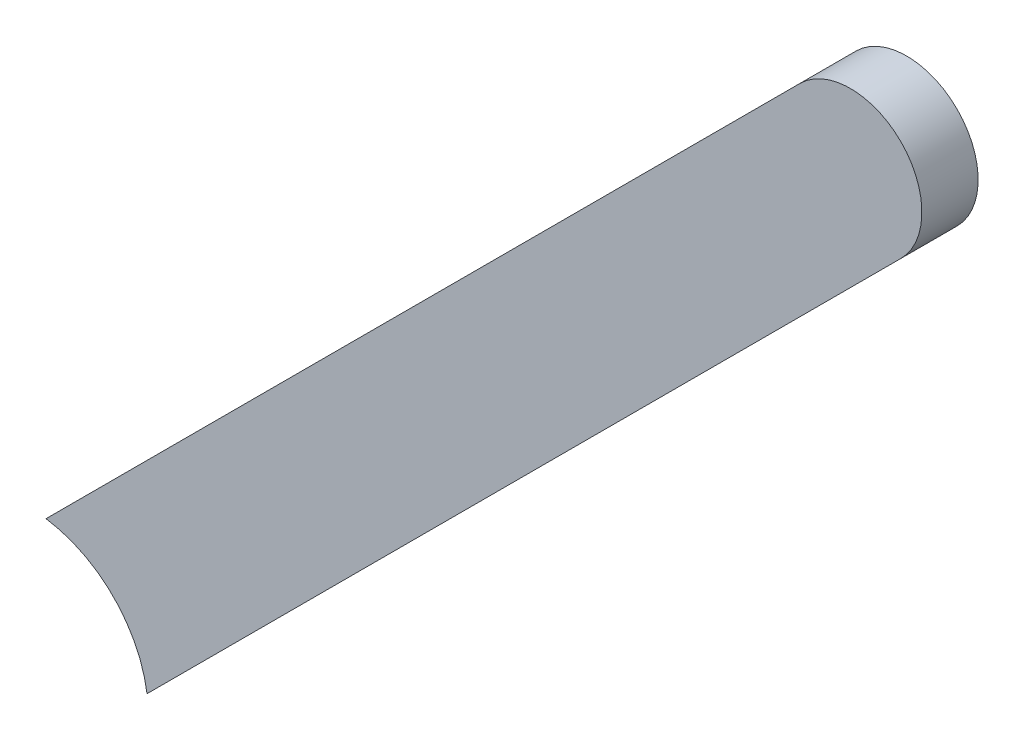
ISO-10303-21;
HEADER;
FILE_DESCRIPTION(('STEP AP214'),'2;1');
FILE_NAME('part.step','',(''),(''),'','','');
FILE_SCHEMA(('AUTOMOTIVE_DESIGN { 1 0 10303 214 1 1 1 1 }'));
ENDSEC;
DATA;
#1=APPLICATION_CONTEXT('core data for automotive mechanical design processes');
#2=APPLICATION_PROTOCOL_DEFINITION('international standard','automotive_design',2000,#1);
#3=PRODUCT_CONTEXT('',#1,'mechanical');
#4=PRODUCT('Part','Part','',(#3));
#5=PRODUCT_RELATED_PRODUCT_CATEGORY('part','',(#4));
#6=PRODUCT_DEFINITION_FORMATION('','',#4);
#7=PRODUCT_DEFINITION_CONTEXT('part definition',#1,'design');
#8=PRODUCT_DEFINITION('design','',#6,#7);
#9=PRODUCT_DEFINITION_SHAPE('','',#8);
#10=(LENGTH_UNIT() NAMED_UNIT(*) SI_UNIT(.MILLI.,.METRE.));
#11=(NAMED_UNIT(*) PLANE_ANGLE_UNIT() SI_UNIT($,.RADIAN.));
#12=(NAMED_UNIT(*) SI_UNIT($,.STERADIAN.) SOLID_ANGLE_UNIT());
#13=UNCERTAINTY_MEASURE_WITH_UNIT(LENGTH_MEASURE(1.E-05),#10,'distance_accuracy_value','');
#14=(GEOMETRIC_REPRESENTATION_CONTEXT(3) GLOBAL_UNCERTAINTY_ASSIGNED_CONTEXT((#13)) GLOBAL_UNIT_ASSIGNED_CONTEXT((#10,
#11,#12)) REPRESENTATION_CONTEXT('',''));
#15=CARTESIAN_POINT('',(0.,0.,0.));
#16=DIRECTION('',(0.,0.,1.));
#17=DIRECTION('',(1.,0.,0.));
#18=AXIS2_PLACEMENT_3D('',#15,#16,#17);
#19=CARTESIAN_POINT('',(132.50055071545,108.64633883545,0.));
#20=DIRECTION('',(-0.707106781186548,0.707106781186548,0.));
#21=DIRECTION('',(0.707106781186548,0.707106781186548,0.));
#22=AXIS2_PLACEMENT_3D('',#19,#20,#21);
#23=PLANE('',#22);
#24=DIRECTION('',(0.707106781186548,0.707106781186548,0.));
#25=VECTOR('',#24,1.);
#26=CARTESIAN_POINT('',(132.25960594,108.40539406,0.1999996));
#27=LINE('',#26,#25);
#28=CARTESIAN_POINT('',(132.50055071545,108.64633883545,0.1999996));
#29=VERTEX_POINT('',#28);
#30=CARTESIAN_POINT('',(135.18060594,111.32639406,0.1999996));
#31=VERTEX_POINT('',#30);
#32=EDGE_CURVE('E11',#29,#31,#27,.T.);
#33=ORIENTED_EDGE('',*,*,#32,.F.);
#34=DIRECTION('',(0.,0.,1.));
#35=VECTOR('',#34,1.);
#36=CARTESIAN_POINT('',(132.50055071545,108.64633883545,0.));
#37=LINE('',#36,#35);
#38=CARTESIAN_POINT('',(132.50055071545,108.64633883545,0.));
#39=VERTEX_POINT('',#38);
#40=EDGE_CURVE('E24',#39,#29,#37,.T.);
#41=ORIENTED_EDGE('',*,*,#40,.F.);
#42=DIRECTION('',(0.707106781186548,0.707106781186548,0.));
#43=VECTOR('',#42,1.);
#44=CARTESIAN_POINT('',(132.25960594,108.40539406,0.));
#45=LINE('',#44,#43);
#46=CARTESIAN_POINT('',(135.18060594,111.32639406,0.));
#47=VERTEX_POINT('',#46);
#48=EDGE_CURVE('E75',#39,#47,#45,.T.);
#49=ORIENTED_EDGE('',*,*,#48,.T.);
#50=DIRECTION('',(0.,0.,1.));
#51=VECTOR('',#50,1.);
#52=CARTESIAN_POINT('',(135.18060594,111.32639406,0.));
#53=LINE('',#52,#51);
#54=EDGE_CURVE('E37',#47,#31,#53,.T.);
#55=ORIENTED_EDGE('',*,*,#54,.T.);
#56=EDGE_LOOP('',(#33,#41,#49,#55));
#57=FACE_BOUND('',#56,.T.);
#58=ADVANCED_FACE('F17',(#57),#23,.F.);
#59=CARTESIAN_POINT('',(135.001,111.506,0.));
#60=DIRECTION('',(0.,0.,-1.));
#61=DIRECTION('',(0.707106781186576,-0.70710678118652,0.));
#62=AXIS2_PLACEMENT_3D('',#59,#60,#61);
#63=CYLINDRICAL_SURFACE('',#62,0.254001156230774);
#64=CARTESIAN_POINT('',(135.001,111.506,0.1999996));
#65=DIRECTION('',(0.,0.,1.));
#66=DIRECTION('',(0.707106781186576,-0.70710678118652,0.));
#67=AXIS2_PLACEMENT_3D('',#64,#65,#66);
#68=CIRCLE('',#67,0.254001156230774);
#69=CARTESIAN_POINT('',(134.82139406,111.68560594,0.1999996));
#70=VERTEX_POINT('',#69);
#71=EDGE_CURVE('E83',#31,#70,#68,.T.);
#72=ORIENTED_EDGE('',*,*,#71,.F.);
#73=ORIENTED_EDGE('',*,*,#54,.F.);
#74=CARTESIAN_POINT('',(135.001,111.506,0.));
#75=DIRECTION('',(0.,0.,1.));
#76=DIRECTION('',(0.707106781186576,-0.70710678118652,0.));
#77=AXIS2_PLACEMENT_3D('',#74,#75,#76);
#78=CIRCLE('',#77,0.254001156230774);
#79=CARTESIAN_POINT('',(134.82139406,111.68560594,0.));
#80=VERTEX_POINT('',#79);
#81=EDGE_CURVE('E81',#47,#80,#78,.T.);
#82=ORIENTED_EDGE('',*,*,#81,.T.);
#83=DIRECTION('',(0.,0.,1.));
#84=VECTOR('',#83,1.);
#85=CARTESIAN_POINT('',(134.82139406,111.68560594,0.));
#86=LINE('',#85,#84);
#87=EDGE_CURVE('E67',#80,#70,#86,.T.);
#88=ORIENTED_EDGE('',*,*,#87,.T.);
#89=EDGE_LOOP('',(#72,#73,#82,#88));
#90=FACE_BOUND('',#89,.T.);
#91=ADVANCED_FACE('F89',(#90),#63,.T.);
#92=CARTESIAN_POINT('',(134.82139406,111.68560594,0.));
#93=DIRECTION('',(0.707106781186548,-0.707106781186548,0.));
#94=DIRECTION('',(-0.707106781186548,-0.707106781186548,0.));
#95=AXIS2_PLACEMENT_3D('',#92,#93,#94);
#96=PLANE('',#95);
#97=DIRECTION('',(-0.707106781186548,-0.707106781186548,0.));
#98=VECTOR('',#97,1.);
#99=CARTESIAN_POINT('',(134.82139406,111.68560594,0.1999996));
#100=LINE('',#99,#98);
#101=CARTESIAN_POINT('',(132.14133883545,109.00555071545,0.1999996));
#102=VERTEX_POINT('',#101);
#103=EDGE_CURVE('E71',#70,#102,#100,.T.);
#104=ORIENTED_EDGE('',*,*,#103,.F.);
#105=ORIENTED_EDGE('',*,*,#87,.F.);
#106=DIRECTION('',(-0.707106781186548,-0.707106781186548,0.));
#107=VECTOR('',#106,1.);
#108=CARTESIAN_POINT('',(134.82139406,111.68560594,0.));
#109=LINE('',#108,#107);
#110=CARTESIAN_POINT('',(132.14133883545,109.00555071545,0.));
#111=VERTEX_POINT('',#110);
#112=EDGE_CURVE('E63',#80,#111,#109,.T.);
#113=ORIENTED_EDGE('',*,*,#112,.T.);
#114=DIRECTION('',(0.,0.,1.));
#115=VECTOR('',#114,1.);
#116=CARTESIAN_POINT('',(132.14133883545,109.00555071545,0.));
#117=LINE('',#116,#115);
#118=EDGE_CURVE('E53',#111,#102,#117,.T.);
#119=ORIENTED_EDGE('',*,*,#118,.T.);
#120=EDGE_LOOP('',(#104,#105,#113,#119));
#121=FACE_BOUND('',#120,.T.);
#122=ADVANCED_FACE('F66',(#121),#96,.F.);
#123=CARTESIAN_POINT('',(132.08,108.585,0.));
#124=DIRECTION('',(0.,0.,-1.));
#125=DIRECTION('',(1.,0.,0.));
#126=AXIS2_PLACEMENT_3D('',#123,#124,#125);
#127=CYLINDRICAL_SURFACE('',#126,0.42500042);
#128=ORIENTED_EDGE('',*,*,#40,.T.);
#129=CARTESIAN_POINT('',(132.08,108.585,0.1999996));
#130=DIRECTION('',(0.,0.,1.));
#131=DIRECTION('',(1.,0.,0.));
#132=AXIS2_PLACEMENT_3D('',#129,#130,#131);
#133=CIRCLE('',#132,0.42500042);
#134=EDGE_CURVE('E59',#29,#102,#133,.T.);
#135=ORIENTED_EDGE('',*,*,#134,.T.);
#136=ORIENTED_EDGE('',*,*,#118,.F.);
#137=CARTESIAN_POINT('',(132.08,108.585,0.));
#138=DIRECTION('',(0.,0.,1.));
#139=DIRECTION('',(1.,0.,0.));
#140=AXIS2_PLACEMENT_3D('',#137,#138,#139);
#141=CIRCLE('',#140,0.42500042);
#142=EDGE_CURVE('E57',#39,#111,#141,.T.);
#143=ORIENTED_EDGE('',*,*,#142,.F.);
#144=EDGE_LOOP('',(#128,#135,#136,#143));
#145=FACE_BOUND('',#144,.T.);
#146=ADVANCED_FACE('F55',(#145),#127,.F.);
#147=CARTESIAN_POINT('',(132.25960594,108.40539406,0.));
#148=DIRECTION('',(0.,0.,-1.));
#149=DIRECTION('',(-1.,0.,0.));
#150=AXIS2_PLACEMENT_3D('',#147,#148,#149);
#151=PLANE('',#150);
#152=ORIENTED_EDGE('',*,*,#48,.F.);
#153=ORIENTED_EDGE('',*,*,#142,.T.);
#154=ORIENTED_EDGE('',*,*,#112,.F.);
#155=ORIENTED_EDGE('',*,*,#81,.F.);
#156=EDGE_LOOP('',(#152,#153,#154,#155));
#157=FACE_BOUND('',#156,.T.);
#158=ADVANCED_FACE('F74',(#157),#151,.T.);
#159=CARTESIAN_POINT('',(132.25960594,108.40539406,0.1999996));
#160=DIRECTION('',(0.,0.,-1.));
#161=DIRECTION('',(-1.,0.,0.));
#162=AXIS2_PLACEMENT_3D('',#159,#160,#161);
#163=PLANE('',#162);
#164=ORIENTED_EDGE('',*,*,#134,.F.);
#165=ORIENTED_EDGE('',*,*,#32,.T.);
#166=ORIENTED_EDGE('',*,*,#71,.T.);
#167=ORIENTED_EDGE('',*,*,#103,.T.);
#168=EDGE_LOOP('',(#164,#165,#166,#167));
#169=FACE_BOUND('',#168,.T.);
#170=ADVANCED_FACE('F91',(#169),#163,.F.);
#171=CLOSED_SHELL('',(#58,#91,#122,#146,#158,#170));
#172=MANIFOLD_SOLID_BREP('B1',#171);
#173=ADVANCED_BREP_SHAPE_REPRESENTATION('',(#18,#172),#14);
#174=SHAPE_DEFINITION_REPRESENTATION(#9,#173);
ENDSEC;
END-ISO-10303-21;
